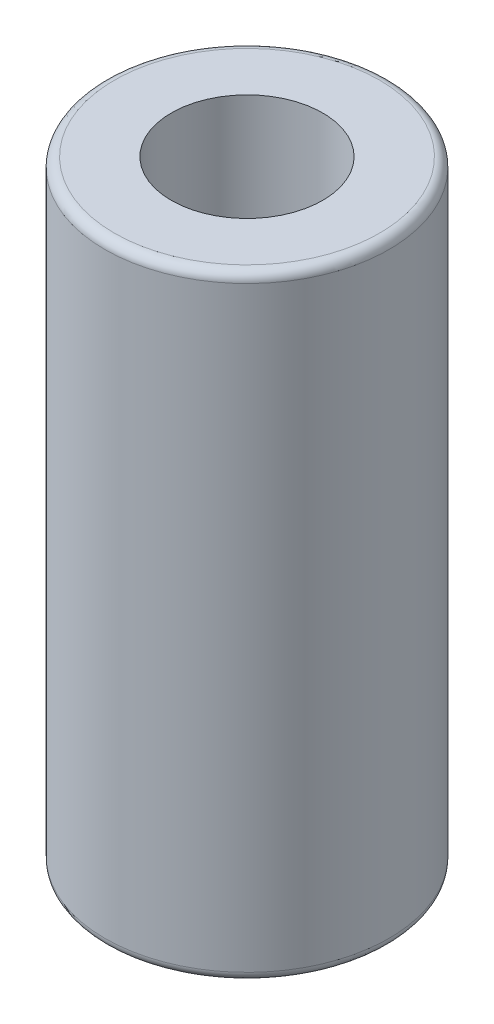
ISO-10303-21;
HEADER;
FILE_DESCRIPTION(('STEP AP214'),'2;1');
FILE_NAME('part.step','',(''),(''),'','','');
FILE_SCHEMA(('AUTOMOTIVE_DESIGN { 1 0 10303 214 1 1 1 1 }'));
ENDSEC;
DATA;
#1=APPLICATION_CONTEXT('core data for automotive mechanical design processes');
#2=APPLICATION_PROTOCOL_DEFINITION('international standard','automotive_design',2000,#1);
#3=PRODUCT_CONTEXT('',#1,'mechanical');
#4=PRODUCT('Part','Part','',(#3));
#5=PRODUCT_RELATED_PRODUCT_CATEGORY('part','',(#4));
#6=PRODUCT_DEFINITION_FORMATION('','',#4);
#7=PRODUCT_DEFINITION_CONTEXT('part definition',#1,'design');
#8=PRODUCT_DEFINITION('design','',#6,#7);
#9=PRODUCT_DEFINITION_SHAPE('','',#8);
#10=(LENGTH_UNIT() NAMED_UNIT(*) SI_UNIT(.MILLI.,.METRE.));
#11=(NAMED_UNIT(*) PLANE_ANGLE_UNIT() SI_UNIT($,.RADIAN.));
#12=(NAMED_UNIT(*) SI_UNIT($,.STERADIAN.) SOLID_ANGLE_UNIT());
#13=UNCERTAINTY_MEASURE_WITH_UNIT(LENGTH_MEASURE(1.E-05),#10,'distance_accuracy_value','');
#14=(GEOMETRIC_REPRESENTATION_CONTEXT(3) GLOBAL_UNCERTAINTY_ASSIGNED_CONTEXT((#13)) GLOBAL_UNIT_ASSIGNED_CONTEXT((#10,
#11,#12)) REPRESENTATION_CONTEXT('',''));
#15=CARTESIAN_POINT('',(0.,0.,0.));
#16=DIRECTION('',(0.,0.,1.));
#17=DIRECTION('',(1.,0.,0.));
#18=AXIS2_PLACEMENT_3D('',#15,#16,#17);
#19=CARTESIAN_POINT('',(0.,13.,0.));
#20=DIRECTION('',(0.,-1.,0.));
#21=DIRECTION('',(0.,0.,-1.));
#22=AXIS2_PLACEMENT_3D('',#19,#20,#21);
#23=CYLINDRICAL_SURFACE('',#22,3.);
#24=CARTESIAN_POINT('',(0.,0.200000000000001,0.));
#25=DIRECTION('',(0.,1.,0.));
#26=DIRECTION('',(0.,0.,1.));
#27=AXIS2_PLACEMENT_3D('',#24,#25,#26);
#28=CIRCLE('',#27,3.);
#29=CARTESIAN_POINT('',(0.,0.199999999999999,-3.));
#30=VERTEX_POINT('',#29);
#31=EDGE_CURVE('E42',#30,#30,#28,.T.);
#32=CARTESIAN_POINT('',(0.,12.8,0.));
#33=DIRECTION('',(0.,1.,0.));
#34=DIRECTION('',(0.,0.,1.));
#35=AXIS2_PLACEMENT_3D('',#32,#33,#34);
#36=CIRCLE('',#35,3.);
#37=CARTESIAN_POINT('',(0.,12.8,-3.));
#38=VERTEX_POINT('',#37);
#39=EDGE_CURVE('E46',#38,#38,#36,.F.);
#40=CARTESIAN_POINT('',(0.,0.199999999999999,-3.));
#41=CARTESIAN_POINT('',(0.,0.331249999999999,-3.));
#42=CARTESIAN_POINT('',(0.,0.462499999999999,-3.));
#43=CARTESIAN_POINT('',(0.,0.724999999999999,-3.));
#44=CARTESIAN_POINT('',(0.,0.856249999999999,-3.));
#45=CARTESIAN_POINT('',(0.,1.11875,-3.));
#46=CARTESIAN_POINT('',(0.,1.25,-3.));
#47=CARTESIAN_POINT('',(0.,1.5125,-3.));
#48=CARTESIAN_POINT('',(0.,1.64375,-3.));
#49=CARTESIAN_POINT('',(0.,1.90625,-3.));
#50=CARTESIAN_POINT('',(0.,2.0375,-3.));
#51=CARTESIAN_POINT('',(0.,2.3,-3.));
#52=CARTESIAN_POINT('',(0.,2.43125,-3.));
#53=CARTESIAN_POINT('',(0.,2.69375,-3.));
#54=CARTESIAN_POINT('',(0.,2.825,-3.));
#55=CARTESIAN_POINT('',(0.,3.0875,-3.));
#56=CARTESIAN_POINT('',(0.,3.21875,-3.));
#57=CARTESIAN_POINT('',(0.,3.48125,-3.));
#58=CARTESIAN_POINT('',(0.,3.6125,-3.));
#59=CARTESIAN_POINT('',(0.,3.875,-3.));
#60=CARTESIAN_POINT('',(0.,4.00625,-3.));
#61=CARTESIAN_POINT('',(0.,4.26875,-3.));
#62=CARTESIAN_POINT('',(0.,4.4,-3.));
#63=CARTESIAN_POINT('',(0.,4.6625,-3.));
#64=CARTESIAN_POINT('',(0.,4.79375,-3.));
#65=CARTESIAN_POINT('',(0.,5.05625,-3.));
#66=CARTESIAN_POINT('',(0.,5.1875,-3.));
#67=CARTESIAN_POINT('',(0.,5.45,-3.));
#68=CARTESIAN_POINT('',(0.,5.58125,-3.));
#69=CARTESIAN_POINT('',(0.,5.84375,-3.));
#70=CARTESIAN_POINT('',(0.,5.975,-3.));
#71=CARTESIAN_POINT('',(0.,6.2375,-3.));
#72=CARTESIAN_POINT('',(0.,6.36875,-3.));
#73=CARTESIAN_POINT('',(0.,6.63125,-3.));
#74=CARTESIAN_POINT('',(0.,6.7625,-3.));
#75=CARTESIAN_POINT('',(0.,7.025,-3.));
#76=CARTESIAN_POINT('',(0.,7.15625,-3.));
#77=CARTESIAN_POINT('',(0.,7.41875,-3.));
#78=CARTESIAN_POINT('',(0.,7.55,-3.));
#79=CARTESIAN_POINT('',(0.,7.8125,-3.));
#80=CARTESIAN_POINT('',(0.,7.94375,-3.));
#81=CARTESIAN_POINT('',(0.,8.20625,-3.));
#82=CARTESIAN_POINT('',(0.,8.3375,-3.));
#83=CARTESIAN_POINT('',(0.,8.6,-3.));
#84=CARTESIAN_POINT('',(0.,8.73125,-3.));
#85=CARTESIAN_POINT('',(0.,8.99375,-3.));
#86=CARTESIAN_POINT('',(0.,9.125,-3.));
#87=CARTESIAN_POINT('',(0.,9.3875,-3.));
#88=CARTESIAN_POINT('',(0.,9.51875,-3.));
#89=CARTESIAN_POINT('',(0.,9.78125,-3.));
#90=CARTESIAN_POINT('',(0.,9.9125,-3.));
#91=CARTESIAN_POINT('',(0.,10.175,-3.));
#92=CARTESIAN_POINT('',(0.,10.30625,-3.));
#93=CARTESIAN_POINT('',(0.,10.56875,-3.));
#94=CARTESIAN_POINT('',(0.,10.7,-3.));
#95=CARTESIAN_POINT('',(0.,10.9625,-3.));
#96=CARTESIAN_POINT('',(0.,11.09375,-3.));
#97=CARTESIAN_POINT('',(0.,11.35625,-3.));
#98=CARTESIAN_POINT('',(0.,11.4875,-3.));
#99=CARTESIAN_POINT('',(0.,11.75,-3.));
#100=CARTESIAN_POINT('',(0.,11.88125,-3.));
#101=CARTESIAN_POINT('',(0.,12.14375,-3.));
#102=CARTESIAN_POINT('',(0.,12.275,-3.));
#103=CARTESIAN_POINT('',(0.,12.5375,-3.));
#104=CARTESIAN_POINT('',(0.,12.66875,-3.));
#105=CARTESIAN_POINT('',(0.,12.8,-3.));
#106=B_SPLINE_CURVE_WITH_KNOTS('',3,(#40,#41,#42,#43,#44,#45,#46,#47,#48,#49,#50,#51,#52,#53,
#54,#55,#56,#57,#58,#59,#60,#61,#62,#63,#64,#65,#66,#67,#68,#69,#70,#71,#72,#73,#74,#75,#76,#77,
#78,#79,#80,#81,#82,#83,#84,#85,#86,#87,#88,#89,#90,#91,#92,#93,#94,#95,#96,#97,#98,#99,#100,
#101,#102,#103,#104,#105),.UNSPECIFIED.,.F.,.F.,(4,2,2,2,2,2,2,2,2,2,2,2,2,2,2,2,2,2,2,2,2,2,2,
2,2,2,2,2,2,2,2,2,4),(0.,0.39375,0.7875,1.18125,1.575,1.96875,2.3625,2.75625,3.15,3.54375,
3.9375,4.33125,4.725,5.11875,5.5125,5.90625,6.3,6.69375,7.0875,7.48125,7.875,8.26875,8.6625,
9.05625,9.45,9.84375,10.2375,10.63125,11.025,11.41875,11.8125,12.20625,12.6),.UNSPECIFIED.);
#107=EDGE_CURVE('BSEAM31',#30,#38,#106,.T.);
#108=ORIENTED_EDGE('',*,*,#31,.T.);
#109=ORIENTED_EDGE('',*,*,#39,.T.);
#110=ORIENTED_EDGE('',*,*,#107,.T.);
#111=ORIENTED_EDGE('',*,*,#107,.F.);
#112=EDGE_LOOP('',(#108,#110,#109,#111));
#113=FACE_BOUND('',#112,.T.);
#114=ADVANCED_FACE('F31',(#113),#23,.T.);
#115=CARTESIAN_POINT('',(0.,13.,0.));
#116=DIRECTION('',(0.,1.,0.));
#117=DIRECTION('',(0.,0.,1.));
#118=AXIS2_PLACEMENT_3D('',#115,#116,#117);
#119=PLANE('',#118);
#120=CARTESIAN_POINT('',(0.,13.,0.));
#121=DIRECTION('',(0.,1.,0.));
#122=DIRECTION('',(0.,0.,1.));
#123=AXIS2_PLACEMENT_3D('',#120,#121,#122);
#124=CIRCLE('',#123,2.8);
#125=CARTESIAN_POINT('',(0.,13.,2.8));
#126=VERTEX_POINT('',#125);
#127=EDGE_CURVE('E10',#126,#126,#124,.T.);
#128=ORIENTED_EDGE('',*,*,#127,.T.);
#129=EDGE_LOOP('',(#128));
#130=FACE_BOUND('',#129,.T.);
#131=CARTESIAN_POINT('',(0.,13.,0.));
#132=DIRECTION('',(0.,1.,0.));
#133=DIRECTION('',(0.,0.,1.));
#134=AXIS2_PLACEMENT_3D('',#131,#132,#133);
#135=CIRCLE('',#134,1.6);
#136=CARTESIAN_POINT('',(0.,13.,1.6));
#137=VERTEX_POINT('',#136);
#138=EDGE_CURVE('E52',#137,#137,#135,.T.);
#139=ORIENTED_EDGE('',*,*,#138,.F.);
#140=EDGE_LOOP('',(#139));
#141=FACE_BOUND('',#140,.T.);
#142=ADVANCED_FACE('F67',(#130,#141),#119,.T.);
#143=CARTESIAN_POINT('',(0.,0.,0.));
#144=DIRECTION('',(0.,1.,0.));
#145=DIRECTION('',(0.,0.,1.));
#146=AXIS2_PLACEMENT_3D('',#143,#144,#145);
#147=PLANE('',#146);
#148=CARTESIAN_POINT('',(0.,0.,0.));
#149=DIRECTION('',(0.,1.,0.));
#150=DIRECTION('',(0.,0.,1.));
#151=AXIS2_PLACEMENT_3D('',#148,#149,#150);
#152=CIRCLE('',#151,2.8);
#153=CARTESIAN_POINT('',(0.,0.,2.8));
#154=VERTEX_POINT('',#153);
#155=EDGE_CURVE('E38',#154,#154,#152,.F.);
#156=ORIENTED_EDGE('',*,*,#155,.T.);
#157=EDGE_LOOP('',(#156));
#158=FACE_BOUND('',#157,.T.);
#159=CARTESIAN_POINT('',(0.,0.,0.));
#160=DIRECTION('',(0.,1.,0.));
#161=DIRECTION('',(0.,0.,1.));
#162=AXIS2_PLACEMENT_3D('',#159,#160,#161);
#163=CIRCLE('',#162,1.6);
#164=CARTESIAN_POINT('',(0.,0.,1.6));
#165=VERTEX_POINT('',#164);
#166=EDGE_CURVE('E51',#165,#165,#163,.T.);
#167=ORIENTED_EDGE('',*,*,#166,.T.);
#168=EDGE_LOOP('',(#167));
#169=FACE_BOUND('',#168,.T.);
#170=ADVANCED_FACE('F58',(#158,#169),#147,.F.);
#171=CARTESIAN_POINT('',(0.,0.,0.));
#172=DIRECTION('',(0.,1.,0.));
#173=DIRECTION('',(0.,0.,1.));
#174=AXIS2_PLACEMENT_3D('',#171,#172,#173);
#175=CYLINDRICAL_SURFACE('',#174,1.6);
#176=CARTESIAN_POINT('',(0.,0.,1.6));
#177=CARTESIAN_POINT('',(0.,0.135416666666666,1.6));
#178=CARTESIAN_POINT('',(0.,0.270833333333333,1.6));
#179=CARTESIAN_POINT('',(0.,0.541666666666667,1.6));
#180=CARTESIAN_POINT('',(0.,0.677083333333333,1.6));
#181=CARTESIAN_POINT('',(0.,0.947916666666667,1.6));
#182=CARTESIAN_POINT('',(0.,1.08333333333333,1.6));
#183=CARTESIAN_POINT('',(0.,1.35416666666667,1.6));
#184=CARTESIAN_POINT('',(0.,1.48958333333333,1.6));
#185=CARTESIAN_POINT('',(0.,1.76041666666667,1.6));
#186=CARTESIAN_POINT('',(0.,1.89583333333333,1.6));
#187=CARTESIAN_POINT('',(0.,2.16666666666667,1.6));
#188=CARTESIAN_POINT('',(0.,2.30208333333333,1.6));
#189=CARTESIAN_POINT('',(0.,2.57291666666667,1.6));
#190=CARTESIAN_POINT('',(0.,2.70833333333333,1.6));
#191=CARTESIAN_POINT('',(0.,2.97916666666667,1.6));
#192=CARTESIAN_POINT('',(0.,3.11458333333333,1.6));
#193=CARTESIAN_POINT('',(0.,3.38541666666667,1.6));
#194=CARTESIAN_POINT('',(0.,3.52083333333333,1.6));
#195=CARTESIAN_POINT('',(0.,3.79166666666667,1.6));
#196=CARTESIAN_POINT('',(0.,3.92708333333333,1.6));
#197=CARTESIAN_POINT('',(0.,4.19791666666667,1.6));
#198=CARTESIAN_POINT('',(0.,4.33333333333333,1.6));
#199=CARTESIAN_POINT('',(0.,4.60416666666667,1.6));
#200=CARTESIAN_POINT('',(0.,4.73958333333333,1.6));
#201=CARTESIAN_POINT('',(0.,5.01041666666667,1.6));
#202=CARTESIAN_POINT('',(0.,5.14583333333333,1.6));
#203=CARTESIAN_POINT('',(0.,5.41666666666667,1.6));
#204=CARTESIAN_POINT('',(0.,5.55208333333333,1.6));
#205=CARTESIAN_POINT('',(0.,5.82291666666667,1.6));
#206=CARTESIAN_POINT('',(0.,5.95833333333333,1.6));
#207=CARTESIAN_POINT('',(0.,6.22916666666667,1.6));
#208=CARTESIAN_POINT('',(0.,6.36458333333333,1.6));
#209=CARTESIAN_POINT('',(0.,6.63541666666667,1.6));
#210=CARTESIAN_POINT('',(0.,6.77083333333333,1.6));
#211=CARTESIAN_POINT('',(0.,7.04166666666667,1.6));
#212=CARTESIAN_POINT('',(0.,7.17708333333333,1.6));
#213=CARTESIAN_POINT('',(0.,7.44791666666667,1.6));
#214=CARTESIAN_POINT('',(0.,7.58333333333333,1.6));
#215=CARTESIAN_POINT('',(0.,7.85416666666667,1.6));
#216=CARTESIAN_POINT('',(0.,7.98958333333333,1.6));
#217=CARTESIAN_POINT('',(0.,8.26041666666667,1.6));
#218=CARTESIAN_POINT('',(0.,8.39583333333333,1.6));
#219=CARTESIAN_POINT('',(0.,8.66666666666667,1.6));
#220=CARTESIAN_POINT('',(0.,8.80208333333333,1.6));
#221=CARTESIAN_POINT('',(0.,9.07291666666667,1.6));
#222=CARTESIAN_POINT('',(0.,9.20833333333333,1.6));
#223=CARTESIAN_POINT('',(0.,9.47916666666667,1.6));
#224=CARTESIAN_POINT('',(0.,9.61458333333333,1.6));
#225=CARTESIAN_POINT('',(0.,9.88541666666667,1.6));
#226=CARTESIAN_POINT('',(0.,10.0208333333333,1.6));
#227=CARTESIAN_POINT('',(0.,10.2916666666667,1.6));
#228=CARTESIAN_POINT('',(0.,10.4270833333333,1.6));
#229=CARTESIAN_POINT('',(0.,10.6979166666667,1.6));
#230=CARTESIAN_POINT('',(0.,10.8333333333333,1.6));
#231=CARTESIAN_POINT('',(0.,11.1041666666667,1.6));
#232=CARTESIAN_POINT('',(0.,11.2395833333333,1.6));
#233=CARTESIAN_POINT('',(0.,11.5104166666667,1.6));
#234=CARTESIAN_POINT('',(0.,11.6458333333333,1.6));
#235=CARTESIAN_POINT('',(0.,11.9166666666667,1.6));
#236=CARTESIAN_POINT('',(0.,12.0520833333333,1.6));
#237=CARTESIAN_POINT('',(0.,12.3229166666667,1.6));
#238=CARTESIAN_POINT('',(0.,12.4583333333333,1.6));
#239=CARTESIAN_POINT('',(0.,12.7291666666667,1.6));
#240=CARTESIAN_POINT('',(0.,12.8645833333333,1.6));
#241=CARTESIAN_POINT('',(0.,13.,1.6));
#242=B_SPLINE_CURVE_WITH_KNOTS('',3,(#176,#177,#178,#179,#180,#181,#182,#183,#184,#185,#186,
#187,#188,#189,#190,#191,#192,#193,#194,#195,#196,#197,#198,#199,#200,#201,#202,#203,#204,#205,
#206,#207,#208,#209,#210,#211,#212,#213,#214,#215,#216,#217,#218,#219,#220,#221,#222,#223,#224,
#225,#226,#227,#228,#229,#230,#231,#232,#233,#234,#235,#236,#237,#238,#239,#240,#241),
.UNSPECIFIED.,.F.,.F.,(4,2,2,2,2,2,2,2,2,2,2,2,2,2,2,2,2,2,2,2,2,2,2,2,2,2,2,2,2,2,2,2,4),(0.,
0.40625,0.8125,1.21875,1.625,2.03125,2.4375,2.84375,3.25,3.65625,4.0625,4.46875,4.875,5.28125,
5.6875,6.09375,6.5,6.90625,7.3125,7.71875,8.125,8.53125,8.9375,9.34375,9.75,10.15625,10.5625,
10.96875,11.375,11.78125,12.1875,12.59375,13.),.UNSPECIFIED.);
#243=EDGE_CURVE('BSEAM60',#165,#137,#242,.T.);
#244=ORIENTED_EDGE('',*,*,#166,.F.);
#245=ORIENTED_EDGE('',*,*,#138,.T.);
#246=ORIENTED_EDGE('',*,*,#243,.T.);
#247=ORIENTED_EDGE('',*,*,#243,.F.);
#248=EDGE_LOOP('',(#244,#246,#245,#247));
#249=FACE_BOUND('',#248,.T.);
#250=ADVANCED_FACE('F60',(#249),#175,.F.);
#251=CARTESIAN_POINT('',(0.,0.200000000000001,0.));
#252=DIRECTION('',(0.,1.,0.));
#253=DIRECTION('',(0.,0.,1.));
#254=AXIS2_PLACEMENT_3D('',#251,#252,#253);
#255=TOROIDAL_SURFACE('',#254,2.8,0.2);
#256=ORIENTED_EDGE('',*,*,#155,.F.);
#257=EDGE_LOOP('',(#256));
#258=FACE_BOUND('',#257,.T.);
#259=ORIENTED_EDGE('',*,*,#31,.F.);
#260=EDGE_LOOP('',(#259));
#261=FACE_BOUND('',#260,.T.);
#262=ADVANCED_FACE('F63',(#258,#261),#255,.T.);
#263=CARTESIAN_POINT('',(0.,12.8,0.));
#264=DIRECTION('',(0.,1.,0.));
#265=DIRECTION('',(0.,0.,1.));
#266=AXIS2_PLACEMENT_3D('',#263,#264,#265);
#267=TOROIDAL_SURFACE('',#266,2.8,0.2);
#268=ORIENTED_EDGE('',*,*,#39,.F.);
#269=EDGE_LOOP('',(#268));
#270=FACE_BOUND('',#269,.T.);
#271=ORIENTED_EDGE('',*,*,#127,.F.);
#272=EDGE_LOOP('',(#271));
#273=FACE_BOUND('',#272,.T.);
#274=ADVANCED_FACE('F33',(#270,#273),#267,.T.);
#275=CLOSED_SHELL('',(#114,#142,#170,#250,#262,#274));
#276=MANIFOLD_SOLID_BREP('B2',#275);
#277=ADVANCED_BREP_SHAPE_REPRESENTATION('',(#18,#276),#14);
#278=SHAPE_DEFINITION_REPRESENTATION(#9,#277);
ENDSEC;
END-ISO-10303-21;
